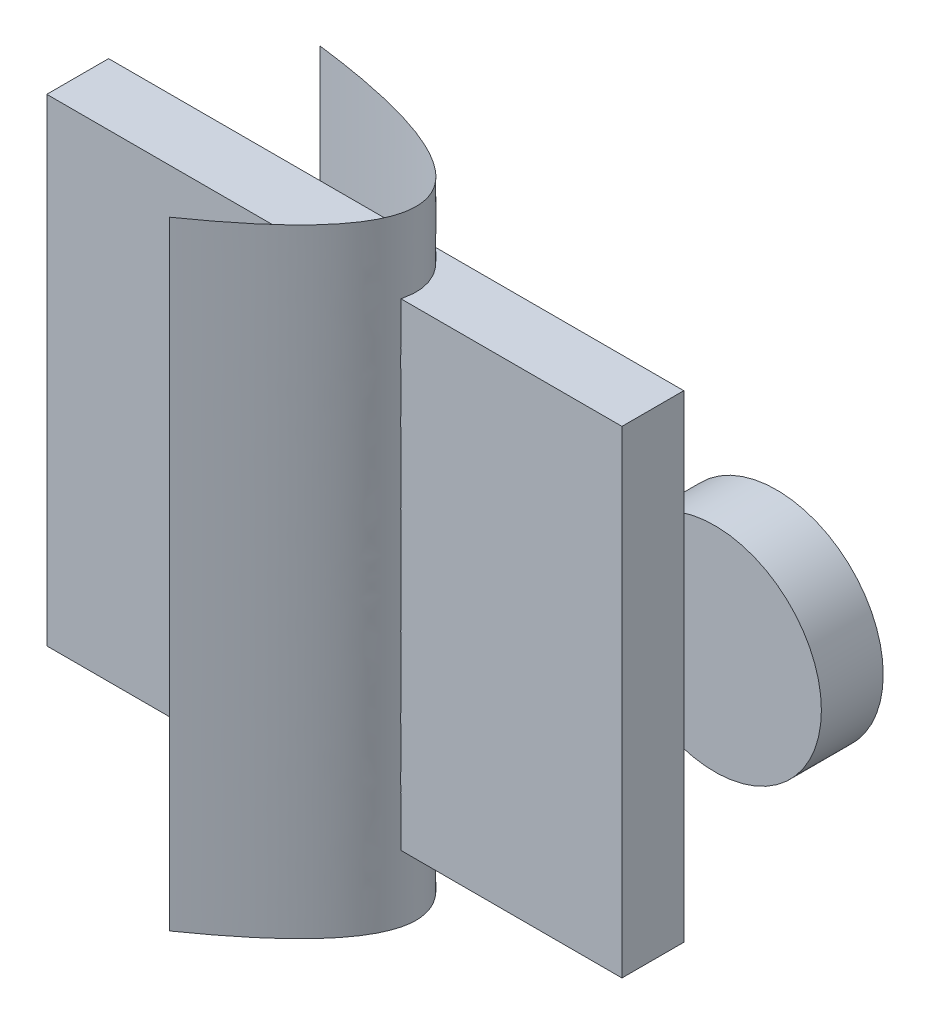
ISO-10303-21;
HEADER;
FILE_DESCRIPTION(('STEP AP214'),'2;1');
FILE_NAME('part.step','',(''),(''),'','','');
FILE_SCHEMA(('AUTOMOTIVE_DESIGN { 1 0 10303 214 1 1 1 1 }'));
ENDSEC;
DATA;
#1=APPLICATION_CONTEXT('core data for automotive mechanical design processes');
#2=APPLICATION_PROTOCOL_DEFINITION('international standard','automotive_design',2000,#1);
#3=PRODUCT_CONTEXT('',#1,'mechanical');
#4=PRODUCT('Part','Part','',(#3));
#5=PRODUCT_RELATED_PRODUCT_CATEGORY('part','',(#4));
#6=PRODUCT_DEFINITION_FORMATION('','',#4);
#7=PRODUCT_DEFINITION_CONTEXT('part definition',#1,'design');
#8=PRODUCT_DEFINITION('design','',#6,#7);
#9=PRODUCT_DEFINITION_SHAPE('','',#8);
#10=(LENGTH_UNIT() NAMED_UNIT(*) SI_UNIT(.MILLI.,.METRE.));
#11=(NAMED_UNIT(*) PLANE_ANGLE_UNIT() SI_UNIT($,.RADIAN.));
#12=(NAMED_UNIT(*) SI_UNIT($,.STERADIAN.) SOLID_ANGLE_UNIT());
#13=UNCERTAINTY_MEASURE_WITH_UNIT(LENGTH_MEASURE(1.E-05),#10,'distance_accuracy_value','');
#14=(GEOMETRIC_REPRESENTATION_CONTEXT(3) GLOBAL_UNCERTAINTY_ASSIGNED_CONTEXT((#13)) GLOBAL_UNIT_ASSIGNED_CONTEXT((#10,
#11,#12)) REPRESENTATION_CONTEXT('',''));
#15=CARTESIAN_POINT('',(0.,0.,0.));
#16=DIRECTION('',(0.,0.,1.));
#17=DIRECTION('',(1.,0.,0.));
#18=AXIS2_PLACEMENT_3D('',#15,#16,#17);
#19=CARTESIAN_POINT('',(-9.8895273624505,0.,29.2716498296639));
#20=CARTESIAN_POINT('',(32.2081101978187,0.,-0.156276991708373));
#21=CARTESIAN_POINT('',(-21.6770448247652,0.,-6.89005628353885));
#22=B_SPLINE_CURVE_WITH_KNOTS('',2,(#19,#20,#21),.UNSPECIFIED.,.F.,.F.,(3,3),(0.,1.),.UNSPECIFIED.);
#23=DIRECTION('',(0.,1.,0.));
#24=VECTOR('',#23,1.);
#25=SURFACE_OF_LINEAR_EXTRUSION('',#22,#24);
#26=CARTESIAN_POINT('',(-9.8895273624505,50.,29.2716498296639));
#27=CARTESIAN_POINT('',(32.2081101978187,50.,-0.156276991708373));
#28=CARTESIAN_POINT('',(-21.6770448247652,50.,-6.89005628353885));
#29=B_SPLINE_CURVE_WITH_KNOTS('',2,(#26,#27,#28),.UNSPECIFIED.,.F.,.F.,(3,3),(0.,1.),.UNSPECIFIED.);
#30=CARTESIAN_POINT('',(-9.8895273624505,50.,29.2716498296639));
#31=VERTEX_POINT('',#30);
#32=CARTESIAN_POINT('',(-21.6770448247652,50.,-6.89005628353885));
#33=VERTEX_POINT('',#32);
#34=EDGE_CURVE('E58',#31,#33,#29,.T.);
#35=ORIENTED_EDGE('',*,*,#34,.F.);
#36=DIRECTION('',(0.,1.,0.));
#37=VECTOR('',#36,1.);
#38=CARTESIAN_POINT('',(-9.8895273624505,0.,29.2716498296639));
#39=LINE('',#38,#37);
#40=CARTESIAN_POINT('',(-9.8895273624505,-50.,29.2716498296639));
#41=VERTEX_POINT('',#40);
#42=EDGE_CURVE('E50',#41,#31,#39,.T.);
#43=ORIENTED_EDGE('',*,*,#42,.F.);
#44=CARTESIAN_POINT('',(-9.8895273624505,-50.,29.2716498296639));
#45=CARTESIAN_POINT('',(32.2081101978187,-50.,-0.156276991708373));
#46=CARTESIAN_POINT('',(-21.6770448247652,-50.,-6.89005628353885));
#47=B_SPLINE_CURVE_WITH_KNOTS('',2,(#44,#45,#46),.UNSPECIFIED.,.F.,.F.,(3,3),(0.,1.),.UNSPECIFIED.);
#48=CARTESIAN_POINT('',(-21.6770448247652,-50.,-6.89005628353885));
#49=VERTEX_POINT('',#48);
#50=EDGE_CURVE('E68',#41,#49,#47,.T.);
#51=ORIENTED_EDGE('',*,*,#50,.T.);
#52=DIRECTION('',(0.,1.,0.));
#53=VECTOR('',#52,1.);
#54=CARTESIAN_POINT('',(-21.6770448247652,0.,-6.89005628353885));
#55=LINE('',#54,#53);
#56=EDGE_CURVE('E12',#49,#33,#55,.T.);
#57=ORIENTED_EDGE('',*,*,#56,.T.);
#58=EDGE_LOOP('',(#35,#43,#51,#57));
#59=FACE_BOUND('',#58,.T.);
#60=ADVANCED_FACE('F48',(#59),#25,.T.);
#61=OPEN_SHELL('',(#60));
#62=SHELL_BASED_SURFACE_MODEL('B2',(#61));
#63=CARTESIAN_POINT('',(44.0481916480239,-0.618220233656479,-15.));
#64=DIRECTION('',(0.,0.,1.));
#65=DIRECTION('',(1.,0.,0.));
#66=AXIS2_PLACEMENT_3D('',#63,#64,#65);
#67=CYLINDRICAL_SURFACE('',#66,17.2617733123611);
#68=CARTESIAN_POINT('',(44.0481916480239,-0.618220233656479,-15.));
#69=DIRECTION('',(0.,0.,1.));
#70=DIRECTION('',(1.,0.,0.));
#71=AXIS2_PLACEMENT_3D('',#68,#69,#70);
#72=CIRCLE('',#71,17.2617733123611);
#73=CARTESIAN_POINT('',(61.309964960385,-0.618220233656479,-15.));
#74=VERTEX_POINT('',#73);
#75=EDGE_CURVE('E47',#74,#74,#72,.T.);
#76=ORIENTED_EDGE('',*,*,#75,.T.);
#77=EDGE_LOOP('',(#76));
#78=FACE_BOUND('',#77,.T.);
#79=CARTESIAN_POINT('',(44.0481916480239,-0.618220233656479,-5.));
#80=DIRECTION('',(0.,0.,1.));
#81=DIRECTION('',(1.,0.,0.));
#82=AXIS2_PLACEMENT_3D('',#79,#80,#81);
#83=CIRCLE('',#82,17.2617733123611);
#84=CARTESIAN_POINT('',(61.309964960385,-0.618220233656479,-5.));
#85=VERTEX_POINT('',#84);
#86=EDGE_CURVE('E120',#85,#85,#83,.T.);
#87=ORIENTED_EDGE('',*,*,#86,.F.);
#88=EDGE_LOOP('',(#87));
#89=FACE_BOUND('',#88,.T.);
#90=ADVANCED_FACE('F117',(#78,#89),#67,.T.);
#91=CARTESIAN_POINT('',(44.0481916480239,-0.618220233656479,-15.));
#92=DIRECTION('',(0.,0.,1.));
#93=DIRECTION('',(1.,0.,0.));
#94=AXIS2_PLACEMENT_3D('',#91,#92,#93);
#95=PLANE('',#94);
#96=ORIENTED_EDGE('',*,*,#75,.F.);
#97=EDGE_LOOP('',(#96));
#98=FACE_BOUND('',#97,.T.);
#99=ADVANCED_FACE('F132',(#98),#95,.F.);
#100=CARTESIAN_POINT('',(44.0481916480239,-0.618220233656479,-5.));
#101=DIRECTION('',(0.,0.,1.));
#102=DIRECTION('',(1.,0.,0.));
#103=AXIS2_PLACEMENT_3D('',#100,#101,#102);
#104=PLANE('',#103);
#105=ORIENTED_EDGE('',*,*,#86,.T.);
#106=EDGE_LOOP('',(#105));
#107=FACE_BOUND('',#106,.T.);
#108=ADVANCED_FACE('F129',(#107),#104,.T.);
#109=CLOSED_SHELL('',(#90,#99,#108));
#110=MANIFOLD_SOLID_BREP('B6',#109);
#111=CARTESIAN_POINT('',(-48.9939535172757,38.0205443698732,10.));
#112=DIRECTION('',(1.,0.,0.));
#113=DIRECTION('',(0.,0.,-1.));
#114=AXIS2_PLACEMENT_3D('',#111,#112,#113);
#115=PLANE('',#114);
#116=DIRECTION('',(0.,-1.,0.));
#117=VECTOR('',#116,1.);
#118=CARTESIAN_POINT('',(-48.9939535172757,38.0205443698732,0.));
#119=LINE('',#118,#117);
#120=CARTESIAN_POINT('',(-48.9939535172757,38.0205443698732,0.));
#121=VERTEX_POINT('',#120);
#122=CARTESIAN_POINT('',(-48.9939535172757,-39.2569848371862,0.));
#123=VERTEX_POINT('',#122);
#124=EDGE_CURVE('E220',#121,#123,#119,.T.);
#125=ORIENTED_EDGE('',*,*,#124,.T.);
#126=DIRECTION('',(0.,0.,-1.));
#127=VECTOR('',#126,1.);
#128=CARTESIAN_POINT('',(-48.9939535172757,-39.2569848371862,10.));
#129=LINE('',#128,#127);
#130=CARTESIAN_POINT('',(-48.9939535172757,-39.2569848371862,10.));
#131=VERTEX_POINT('',#130);
#132=EDGE_CURVE('E115',#131,#123,#129,.T.);
#133=ORIENTED_EDGE('',*,*,#132,.F.);
#134=DIRECTION('',(0.,-1.,0.));
#135=VECTOR('',#134,1.);
#136=CARTESIAN_POINT('',(-48.9939535172757,38.0205443698732,10.));
#137=LINE('',#136,#135);
#138=CARTESIAN_POINT('',(-48.9939535172757,38.0205443698732,10.));
#139=VERTEX_POINT('',#138);
#140=EDGE_CURVE('E208',#139,#131,#137,.T.);
#141=ORIENTED_EDGE('',*,*,#140,.F.);
#142=DIRECTION('',(0.,0.,-1.));
#143=VECTOR('',#142,1.);
#144=CARTESIAN_POINT('',(-48.9939535172757,38.0205443698732,10.));
#145=LINE('',#144,#143);
#146=EDGE_CURVE('E216',#139,#121,#145,.T.);
#147=ORIENTED_EDGE('',*,*,#146,.T.);
#148=EDGE_LOOP('',(#125,#133,#141,#147));
#149=FACE_BOUND('',#148,.T.);
#150=ADVANCED_FACE('F157',(#149),#115,.F.);
#151=CARTESIAN_POINT('',(-48.9939535172757,-39.2569848371862,10.));
#152=DIRECTION('',(0.,1.,0.));
#153=DIRECTION('',(0.,0.,1.));
#154=AXIS2_PLACEMENT_3D('',#151,#152,#153);
#155=PLANE('',#154);
#156=DIRECTION('',(1.,0.,0.));
#157=VECTOR('',#156,1.);
#158=CARTESIAN_POINT('',(-48.9939535172757,-39.2569848371862,0.));
#159=LINE('',#158,#157);
#160=CARTESIAN_POINT('',(44.0481916480239,-39.2569848371862,0.));
#161=VERTEX_POINT('',#160);
#162=EDGE_CURVE('E212',#123,#161,#159,.T.);
#163=ORIENTED_EDGE('',*,*,#162,.T.);
#164=DIRECTION('',(0.,0.,-1.));
#165=VECTOR('',#164,1.);
#166=CARTESIAN_POINT('',(44.0481916480239,-39.2569848371862,10.));
#167=LINE('',#166,#165);
#168=CARTESIAN_POINT('',(44.0481916480239,-39.2569848371862,10.));
#169=VERTEX_POINT('',#168);
#170=EDGE_CURVE('E165',#169,#161,#167,.T.);
#171=ORIENTED_EDGE('',*,*,#170,.F.);
#172=DIRECTION('',(1.,0.,0.));
#173=VECTOR('',#172,1.);
#174=CARTESIAN_POINT('',(-48.9939535172757,-39.2569848371862,10.));
#175=LINE('',#174,#173);
#176=EDGE_CURVE('E203',#131,#169,#175,.T.);
#177=ORIENTED_EDGE('',*,*,#176,.F.);
#178=ORIENTED_EDGE('',*,*,#132,.T.);
#179=EDGE_LOOP('',(#163,#171,#177,#178));
#180=FACE_BOUND('',#179,.T.);
#181=ADVANCED_FACE('F211',(#180),#155,.F.);
#182=CARTESIAN_POINT('',(44.0481916480239,38.0205443698732,10.));
#183=DIRECTION('',(-1.,0.,0.));
#184=DIRECTION('',(0.,0.,1.));
#185=AXIS2_PLACEMENT_3D('',#182,#183,#184);
#186=PLANE('',#185);
#187=DIRECTION('',(0.,1.,0.));
#188=VECTOR('',#187,1.);
#189=CARTESIAN_POINT('',(44.0481916480239,38.0205443698732,0.));
#190=LINE('',#189,#188);
#191=CARTESIAN_POINT('',(44.0481916480239,38.0205443698732,0.));
#192=VERTEX_POINT('',#191);
#193=EDGE_CURVE('E190',#161,#192,#190,.T.);
#194=ORIENTED_EDGE('',*,*,#193,.T.);
#195=DIRECTION('',(0.,0.,-1.));
#196=VECTOR('',#195,1.);
#197=CARTESIAN_POINT('',(44.0481916480239,38.0205443698732,10.));
#198=LINE('',#197,#196);
#199=CARTESIAN_POINT('',(44.0481916480239,38.0205443698732,10.));
#200=VERTEX_POINT('',#199);
#201=EDGE_CURVE('E213',#200,#192,#198,.T.);
#202=ORIENTED_EDGE('',*,*,#201,.F.);
#203=DIRECTION('',(0.,1.,0.));
#204=VECTOR('',#203,1.);
#205=CARTESIAN_POINT('',(44.0481916480239,38.0205443698732,10.));
#206=LINE('',#205,#204);
#207=EDGE_CURVE('E206',#169,#200,#206,.T.);
#208=ORIENTED_EDGE('',*,*,#207,.F.);
#209=ORIENTED_EDGE('',*,*,#170,.T.);
#210=EDGE_LOOP('',(#194,#202,#208,#209));
#211=FACE_BOUND('',#210,.T.);
#212=ADVANCED_FACE('F214',(#211),#186,.F.);
#213=CARTESIAN_POINT('',(-48.9939535172757,38.0205443698732,10.));
#214=DIRECTION('',(0.,-1.,0.));
#215=DIRECTION('',(0.,0.,-1.));
#216=AXIS2_PLACEMENT_3D('',#213,#214,#215);
#217=PLANE('',#216);
#218=DIRECTION('',(-1.,0.,0.));
#219=VECTOR('',#218,1.);
#220=CARTESIAN_POINT('',(-48.9939535172757,38.0205443698732,0.));
#221=LINE('',#220,#219);
#222=EDGE_CURVE('E196',#192,#121,#221,.T.);
#223=ORIENTED_EDGE('',*,*,#222,.T.);
#224=ORIENTED_EDGE('',*,*,#146,.F.);
#225=DIRECTION('',(-1.,0.,0.));
#226=VECTOR('',#225,1.);
#227=CARTESIAN_POINT('',(-48.9939535172757,38.0205443698732,10.));
#228=LINE('',#227,#226);
#229=EDGE_CURVE('E173',#200,#139,#228,.T.);
#230=ORIENTED_EDGE('',*,*,#229,.F.);
#231=ORIENTED_EDGE('',*,*,#201,.T.);
#232=EDGE_LOOP('',(#223,#224,#230,#231));
#233=FACE_BOUND('',#232,.T.);
#234=ADVANCED_FACE('F227',(#233),#217,.F.);
#235=CARTESIAN_POINT('',(0.,0.,10.));
#236=DIRECTION('',(0.,0.,1.));
#237=DIRECTION('',(1.,0.,0.));
#238=AXIS2_PLACEMENT_3D('',#235,#236,#237);
#239=PLANE('',#238);
#240=ORIENTED_EDGE('',*,*,#140,.T.);
#241=ORIENTED_EDGE('',*,*,#176,.T.);
#242=ORIENTED_EDGE('',*,*,#207,.T.);
#243=ORIENTED_EDGE('',*,*,#229,.T.);
#244=EDGE_LOOP('',(#240,#241,#242,#243));
#245=FACE_BOUND('',#244,.T.);
#246=ADVANCED_FACE('F204',(#245),#239,.T.);
#247=CARTESIAN_POINT('',(0.,0.,0.));
#248=DIRECTION('',(0.,0.,1.));
#249=DIRECTION('',(1.,0.,0.));
#250=AXIS2_PLACEMENT_3D('',#247,#248,#249);
#251=PLANE('',#250);
#252=ORIENTED_EDGE('',*,*,#124,.F.);
#253=ORIENTED_EDGE('',*,*,#222,.F.);
#254=ORIENTED_EDGE('',*,*,#193,.F.);
#255=ORIENTED_EDGE('',*,*,#162,.F.);
#256=EDGE_LOOP('',(#252,#253,#254,#255));
#257=FACE_BOUND('',#256,.T.);
#258=ADVANCED_FACE('F230',(#257),#251,.F.);
#259=CLOSED_SHELL('',(#150,#181,#212,#234,#246,#258));
#260=MANIFOLD_SOLID_BREP('B42',#259);
#261=ADVANCED_BREP_SHAPE_REPRESENTATION('',(#18,#110,#260),#14);
#262=MANIFOLD_SURFACE_SHAPE_REPRESENTATION('',(#18,#62),#14);
#263=SHAPE_REPRESENTATION('',(#18),#14);
#264=SHAPE_DEFINITION_REPRESENTATION(#9,#263);
#265=SHAPE_REPRESENTATION_RELATIONSHIP('','',#263,#261);
#266=SHAPE_REPRESENTATION_RELATIONSHIP('','',#263,#262);
ENDSEC;
END-ISO-10303-21;
